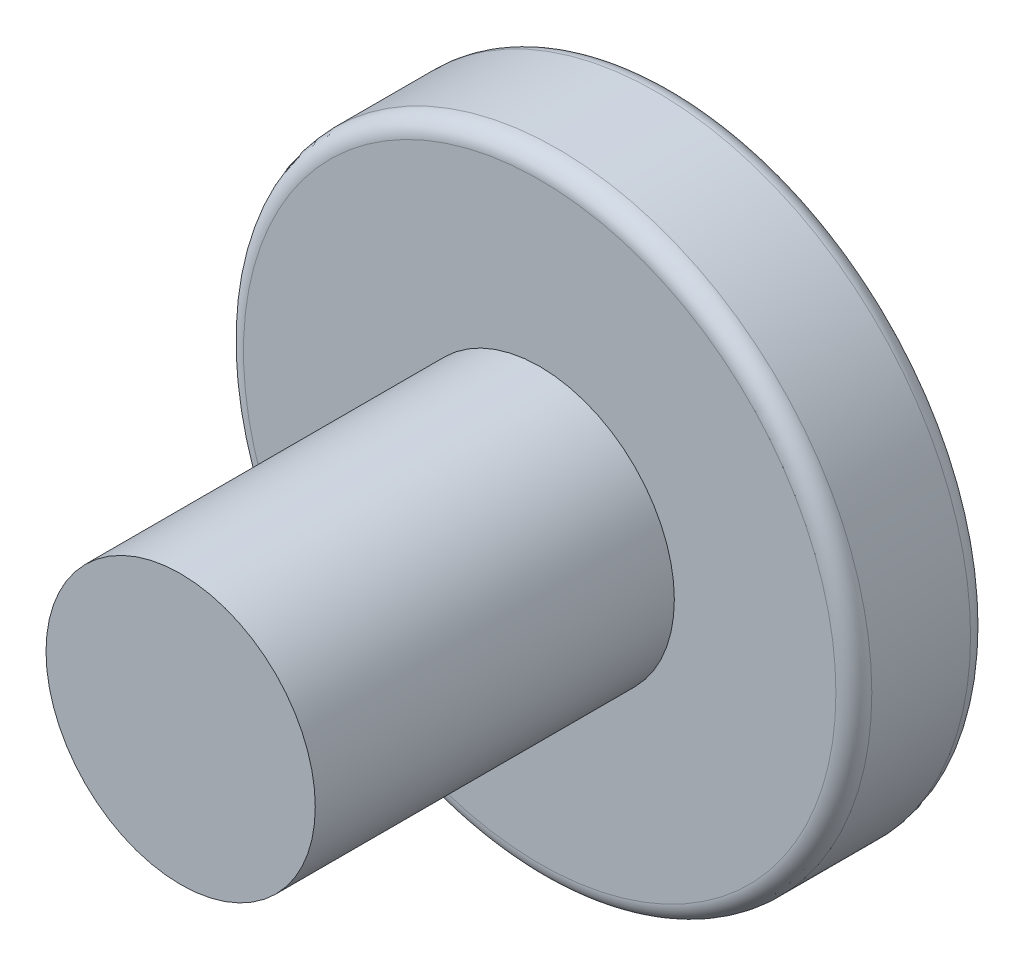
ISO-10303-21;
HEADER;
FILE_DESCRIPTION(('STEP AP214'),'2;1');
FILE_NAME('part.step','',(''),(''),'','','');
FILE_SCHEMA(('AUTOMOTIVE_DESIGN { 1 0 10303 214 1 1 1 1 }'));
ENDSEC;
DATA;
#1=APPLICATION_CONTEXT('core data for automotive mechanical design processes');
#2=APPLICATION_PROTOCOL_DEFINITION('international standard','automotive_design',2000,#1);
#3=PRODUCT_CONTEXT('',#1,'mechanical');
#4=PRODUCT('Part','Part','',(#3));
#5=PRODUCT_RELATED_PRODUCT_CATEGORY('part','',(#4));
#6=PRODUCT_DEFINITION_FORMATION('','',#4);
#7=PRODUCT_DEFINITION_CONTEXT('part definition',#1,'design');
#8=PRODUCT_DEFINITION('design','',#6,#7);
#9=PRODUCT_DEFINITION_SHAPE('','',#8);
#10=(LENGTH_UNIT() NAMED_UNIT(*) SI_UNIT(.MILLI.,.METRE.));
#11=(NAMED_UNIT(*) PLANE_ANGLE_UNIT() SI_UNIT($,.RADIAN.));
#12=(NAMED_UNIT(*) SI_UNIT($,.STERADIAN.) SOLID_ANGLE_UNIT());
#13=UNCERTAINTY_MEASURE_WITH_UNIT(LENGTH_MEASURE(1.E-05),#10,'distance_accuracy_value','');
#14=(GEOMETRIC_REPRESENTATION_CONTEXT(3) GLOBAL_UNCERTAINTY_ASSIGNED_CONTEXT((#13)) GLOBAL_UNIT_ASSIGNED_CONTEXT((#10,
#11,#12)) REPRESENTATION_CONTEXT('',''));
#15=CARTESIAN_POINT('',(0.,0.,0.));
#16=DIRECTION('',(0.,0.,1.));
#17=DIRECTION('',(1.,0.,0.));
#18=AXIS2_PLACEMENT_3D('',#15,#16,#17);
#19=CARTESIAN_POINT('',(0.,0.,1.5));
#20=DIRECTION('',(0.,0.,-1.));
#21=DIRECTION('',(-1.,0.,0.));
#22=AXIS2_PLACEMENT_3D('',#19,#20,#21);
#23=CYLINDRICAL_SURFACE('',#22,3.5);
#24=CARTESIAN_POINT('',(0.,0.,0.2));
#25=DIRECTION('',(0.,0.,1.));
#26=DIRECTION('',(1.,0.,0.));
#27=AXIS2_PLACEMENT_3D('',#24,#25,#26);
#28=CIRCLE('',#27,3.5);
#29=CARTESIAN_POINT('',(3.5,0.,0.2));
#30=VERTEX_POINT('',#29);
#31=EDGE_CURVE('E157',#30,#30,#28,.T.);
#32=ORIENTED_EDGE('',*,*,#31,.T.);
#33=EDGE_LOOP('',(#32));
#34=FACE_BOUND('',#33,.T.);
#35=CARTESIAN_POINT('',(0.,0.,1.3));
#36=DIRECTION('',(0.,0.,1.));
#37=DIRECTION('',(1.,0.,0.));
#38=AXIS2_PLACEMENT_3D('',#35,#36,#37);
#39=CIRCLE('',#38,3.5);
#40=CARTESIAN_POINT('',(3.5,0.,1.3));
#41=VERTEX_POINT('',#40);
#42=EDGE_CURVE('E154',#41,#41,#39,.F.);
#43=ORIENTED_EDGE('',*,*,#42,.T.);
#44=EDGE_LOOP('',(#43));
#45=FACE_BOUND('',#44,.T.);
#46=ADVANCED_FACE('F41',(#34,#45),#23,.T.);
#47=CARTESIAN_POINT('',(0.,0.,1.5));
#48=DIRECTION('',(0.,0.,1.));
#49=DIRECTION('',(1.,0.,0.));
#50=AXIS2_PLACEMENT_3D('',#47,#48,#49);
#51=PLANE('',#50);
#52=CARTESIAN_POINT('',(0.,0.,1.5));
#53=DIRECTION('',(0.,0.,1.));
#54=DIRECTION('',(1.,0.,0.));
#55=AXIS2_PLACEMENT_3D('',#52,#53,#54);
#56=CIRCLE('',#55,3.3);
#57=CARTESIAN_POINT('',(3.3,0.,1.5));
#58=VERTEX_POINT('',#57);
#59=EDGE_CURVE('E11',#58,#58,#56,.T.);
#60=ORIENTED_EDGE('',*,*,#59,.T.);
#61=EDGE_LOOP('',(#60));
#62=FACE_BOUND('',#61,.T.);
#63=CARTESIAN_POINT('',(0.,0.,1.5));
#64=DIRECTION('',(0.,0.,1.));
#65=DIRECTION('',(1.,0.,0.));
#66=AXIS2_PLACEMENT_3D('',#63,#64,#65);
#67=CIRCLE('',#66,1.5);
#68=CARTESIAN_POINT('',(1.5,0.,1.5));
#69=VERTEX_POINT('',#68);
#70=EDGE_CURVE('E151',#69,#69,#67,.T.);
#71=ORIENTED_EDGE('',*,*,#70,.F.);
#72=EDGE_LOOP('',(#71));
#73=FACE_BOUND('',#72,.T.);
#74=ADVANCED_FACE('F172',(#62,#73),#51,.T.);
#75=CARTESIAN_POINT('',(0.,0.,0.));
#76=DIRECTION('',(0.,0.,1.));
#77=DIRECTION('',(1.,0.,0.));
#78=AXIS2_PLACEMENT_3D('',#75,#76,#77);
#79=PLANE('',#78);
#80=DIRECTION('',(0.5,0.866025403784438,0.));
#81=VECTOR('',#80,1.);
#82=CARTESIAN_POINT('',(-1.15470053837925,0.,0.));
#83=LINE('',#82,#81);
#84=CARTESIAN_POINT('',(-1.15470053837925,0.,0.));
#85=VERTEX_POINT('',#84);
#86=CARTESIAN_POINT('',(-0.577350269189626,1.,0.));
#87=VERTEX_POINT('',#86);
#88=EDGE_CURVE('E130',#85,#87,#83,.T.);
#89=ORIENTED_EDGE('',*,*,#88,.F.);
#90=DIRECTION('',(-0.5,0.866025403784439,0.));
#91=VECTOR('',#90,1.);
#92=CARTESIAN_POINT('',(-0.577350269189626,-1.,0.));
#93=LINE('',#92,#91);
#94=CARTESIAN_POINT('',(-0.577350269189626,-1.,0.));
#95=VERTEX_POINT('',#94);
#96=EDGE_CURVE('E56',#95,#85,#93,.T.);
#97=ORIENTED_EDGE('',*,*,#96,.F.);
#98=DIRECTION('',(-1.,0.,0.));
#99=VECTOR('',#98,1.);
#100=CARTESIAN_POINT('',(0.577350269189626,-1.,0.));
#101=LINE('',#100,#99);
#102=CARTESIAN_POINT('',(0.577350269189626,-1.,0.));
#103=VERTEX_POINT('',#102);
#104=EDGE_CURVE('E139',#103,#95,#101,.T.);
#105=ORIENTED_EDGE('',*,*,#104,.F.);
#106=DIRECTION('',(-0.5,-0.866025403784438,0.));
#107=VECTOR('',#106,1.);
#108=CARTESIAN_POINT('',(1.15470053837925,0.,0.));
#109=LINE('',#108,#107);
#110=CARTESIAN_POINT('',(1.15470053837925,0.,0.));
#111=VERTEX_POINT('',#110);
#112=EDGE_CURVE('E137',#111,#103,#109,.T.);
#113=ORIENTED_EDGE('',*,*,#112,.F.);
#114=DIRECTION('',(0.5,-0.866025403784439,0.));
#115=VECTOR('',#114,1.);
#116=CARTESIAN_POINT('',(0.577350269189626,1.,0.));
#117=LINE('',#116,#115);
#118=CARTESIAN_POINT('',(0.577350269189626,1.,0.));
#119=VERTEX_POINT('',#118);
#120=EDGE_CURVE('E104',#119,#111,#117,.T.);
#121=ORIENTED_EDGE('',*,*,#120,.F.);
#122=DIRECTION('',(1.,0.,0.));
#123=VECTOR('',#122,1.);
#124=CARTESIAN_POINT('',(-0.577350269189626,1.,0.));
#125=LINE('',#124,#123);
#126=EDGE_CURVE('E133',#87,#119,#125,.T.);
#127=ORIENTED_EDGE('',*,*,#126,.F.);
#128=EDGE_LOOP('',(#89,#97,#105,#113,#121,#127));
#129=FACE_BOUND('',#128,.T.);
#130=CARTESIAN_POINT('',(0.,0.,0.));
#131=DIRECTION('',(0.,0.,1.));
#132=DIRECTION('',(1.,0.,0.));
#133=AXIS2_PLACEMENT_3D('',#130,#131,#132);
#134=CIRCLE('',#133,3.3);
#135=CARTESIAN_POINT('',(3.3,0.,0.));
#136=VERTEX_POINT('',#135);
#137=EDGE_CURVE('E49',#136,#136,#134,.F.);
#138=ORIENTED_EDGE('',*,*,#137,.T.);
#139=EDGE_LOOP('',(#138));
#140=FACE_BOUND('',#139,.T.);
#141=ADVANCED_FACE('F162',(#129,#140),#79,.F.);
#142=CARTESIAN_POINT('',(0.,0.,5.5));
#143=DIRECTION('',(0.,0.,-1.));
#144=DIRECTION('',(-1.,0.,0.));
#145=AXIS2_PLACEMENT_3D('',#142,#143,#144);
#146=CYLINDRICAL_SURFACE('',#145,1.5);
#147=CARTESIAN_POINT('',(0.,0.,5.5));
#148=DIRECTION('',(0.,0.,1.));
#149=DIRECTION('',(1.,0.,0.));
#150=AXIS2_PLACEMENT_3D('',#147,#148,#149);
#151=CIRCLE('',#150,1.5);
#152=CARTESIAN_POINT('',(1.5,0.,5.5));
#153=VERTEX_POINT('',#152);
#154=EDGE_CURVE('E143',#153,#153,#151,.T.);
#155=ORIENTED_EDGE('',*,*,#154,.F.);
#156=EDGE_LOOP('',(#155));
#157=FACE_BOUND('',#156,.T.);
#158=ORIENTED_EDGE('',*,*,#70,.T.);
#159=EDGE_LOOP('',(#158));
#160=FACE_BOUND('',#159,.T.);
#161=ADVANCED_FACE('F186',(#157,#160),#146,.T.);
#162=CARTESIAN_POINT('',(0.,0.,5.5));
#163=DIRECTION('',(0.,0.,1.));
#164=DIRECTION('',(1.,0.,0.));
#165=AXIS2_PLACEMENT_3D('',#162,#163,#164);
#166=PLANE('',#165);
#167=ORIENTED_EDGE('',*,*,#154,.T.);
#168=EDGE_LOOP('',(#167));
#169=FACE_BOUND('',#168,.T.);
#170=ADVANCED_FACE('F167',(#169),#166,.T.);
#171=CARTESIAN_POINT('',(0.,0.,0.2));
#172=DIRECTION('',(0.,0.,1.));
#173=DIRECTION('',(1.,0.,0.));
#174=AXIS2_PLACEMENT_3D('',#171,#172,#173);
#175=TOROIDAL_SURFACE('',#174,3.3,0.2);
#176=ORIENTED_EDGE('',*,*,#137,.F.);
#177=EDGE_LOOP('',(#176));
#178=FACE_BOUND('',#177,.T.);
#179=ORIENTED_EDGE('',*,*,#31,.F.);
#180=EDGE_LOOP('',(#179));
#181=FACE_BOUND('',#180,.T.);
#182=ADVANCED_FACE('F164',(#178,#181),#175,.T.);
#183=CARTESIAN_POINT('',(0.,0.,1.3));
#184=DIRECTION('',(0.,0.,1.));
#185=DIRECTION('',(1.,0.,0.));
#186=AXIS2_PLACEMENT_3D('',#183,#184,#185);
#187=TOROIDAL_SURFACE('',#186,3.3,0.2);
#188=ORIENTED_EDGE('',*,*,#42,.F.);
#189=EDGE_LOOP('',(#188));
#190=FACE_BOUND('',#189,.T.);
#191=ORIENTED_EDGE('',*,*,#59,.F.);
#192=EDGE_LOOP('',(#191));
#193=FACE_BOUND('',#192,.T.);
#194=ADVANCED_FACE('F43',(#190,#193),#187,.T.);
#195=CARTESIAN_POINT('',(-0.577350269189626,-1.,1.5));
#196=DIRECTION('',(-0.866025403784439,-0.5,0.));
#197=DIRECTION('',(0.5,-0.866025403784439,0.));
#198=AXIS2_PLACEMENT_3D('',#195,#196,#197);
#199=PLANE('',#198);
#200=ORIENTED_EDGE('',*,*,#96,.T.);
#201=DIRECTION('',(0.,0.,-1.));
#202=VECTOR('',#201,1.);
#203=CARTESIAN_POINT('',(-1.15470053837925,0.,1.5));
#204=LINE('',#203,#202);
#205=CARTESIAN_POINT('',(-1.15470053837925,0.,1.5));
#206=VERTEX_POINT('',#205);
#207=EDGE_CURVE('E86',#206,#85,#204,.T.);
#208=ORIENTED_EDGE('',*,*,#207,.F.);
#209=DIRECTION('',(-0.5,0.866025403784439,0.));
#210=VECTOR('',#209,1.);
#211=CARTESIAN_POINT('',(-0.577350269189626,-1.,1.5));
#212=LINE('',#211,#210);
#213=CARTESIAN_POINT('',(-0.577350269189626,-1.,1.5));
#214=VERTEX_POINT('',#213);
#215=EDGE_CURVE('E141',#214,#206,#212,.T.);
#216=ORIENTED_EDGE('',*,*,#215,.F.);
#217=DIRECTION('',(0.,0.,-1.));
#218=VECTOR('',#217,1.);
#219=CARTESIAN_POINT('',(-0.577350269189626,-1.,1.5));
#220=LINE('',#219,#218);
#221=EDGE_CURVE('E64',#214,#95,#220,.T.);
#222=ORIENTED_EDGE('',*,*,#221,.T.);
#223=EDGE_LOOP('',(#200,#208,#216,#222));
#224=FACE_BOUND('',#223,.T.);
#225=ADVANCED_FACE('F178',(#224),#199,.F.);
#226=CARTESIAN_POINT('',(0.577350269189626,-1.,1.5));
#227=DIRECTION('',(0.,-1.,0.));
#228=DIRECTION('',(0.,0.,-1.));
#229=AXIS2_PLACEMENT_3D('',#226,#227,#228);
#230=PLANE('',#229);
#231=ORIENTED_EDGE('',*,*,#104,.T.);
#232=ORIENTED_EDGE('',*,*,#221,.F.);
#233=DIRECTION('',(-1.,0.,0.));
#234=VECTOR('',#233,1.);
#235=CARTESIAN_POINT('',(0.577350269189626,-1.,1.5));
#236=LINE('',#235,#234);
#237=CARTESIAN_POINT('',(0.577350269189626,-1.,1.5));
#238=VERTEX_POINT('',#237);
#239=EDGE_CURVE('E116',#238,#214,#236,.T.);
#240=ORIENTED_EDGE('',*,*,#239,.F.);
#241=DIRECTION('',(0.,0.,-1.));
#242=VECTOR('',#241,1.);
#243=CARTESIAN_POINT('',(0.577350269189626,-1.,1.5));
#244=LINE('',#243,#242);
#245=EDGE_CURVE('E108',#238,#103,#244,.T.);
#246=ORIENTED_EDGE('',*,*,#245,.T.);
#247=EDGE_LOOP('',(#231,#232,#240,#246));
#248=FACE_BOUND('',#247,.T.);
#249=ADVANCED_FACE('F202',(#248),#230,.F.);
#250=CARTESIAN_POINT('',(1.15470053837925,0.,1.5));
#251=DIRECTION('',(0.866025403784439,-0.5,0.));
#252=DIRECTION('',(0.5,0.866025403784439,0.));
#253=AXIS2_PLACEMENT_3D('',#250,#251,#252);
#254=PLANE('',#253);
#255=ORIENTED_EDGE('',*,*,#112,.T.);
#256=ORIENTED_EDGE('',*,*,#245,.F.);
#257=DIRECTION('',(-0.5,-0.866025403784438,0.));
#258=VECTOR('',#257,1.);
#259=CARTESIAN_POINT('',(1.15470053837925,0.,1.5));
#260=LINE('',#259,#258);
#261=CARTESIAN_POINT('',(1.15470053837925,0.,1.5));
#262=VERTEX_POINT('',#261);
#263=EDGE_CURVE('E112',#262,#238,#260,.T.);
#264=ORIENTED_EDGE('',*,*,#263,.F.);
#265=DIRECTION('',(0.,0.,-1.));
#266=VECTOR('',#265,1.);
#267=CARTESIAN_POINT('',(1.15470053837925,0.,1.5));
#268=LINE('',#267,#266);
#269=EDGE_CURVE('E97',#262,#111,#268,.T.);
#270=ORIENTED_EDGE('',*,*,#269,.T.);
#271=EDGE_LOOP('',(#255,#256,#264,#270));
#272=FACE_BOUND('',#271,.T.);
#273=ADVANCED_FACE('F113',(#272),#254,.F.);
#274=CARTESIAN_POINT('',(0.577350269189626,1.,1.5));
#275=DIRECTION('',(0.866025403784439,0.5,0.));
#276=DIRECTION('',(-0.5,0.866025403784439,0.));
#277=AXIS2_PLACEMENT_3D('',#274,#275,#276);
#278=PLANE('',#277);
#279=ORIENTED_EDGE('',*,*,#120,.T.);
#280=ORIENTED_EDGE('',*,*,#269,.F.);
#281=DIRECTION('',(0.5,-0.866025403784439,0.));
#282=VECTOR('',#281,1.);
#283=CARTESIAN_POINT('',(0.577350269189626,1.,1.5));
#284=LINE('',#283,#282);
#285=CARTESIAN_POINT('',(0.577350269189626,1.,1.5));
#286=VERTEX_POINT('',#285);
#287=EDGE_CURVE('E101',#286,#262,#284,.T.);
#288=ORIENTED_EDGE('',*,*,#287,.F.);
#289=DIRECTION('',(0.,0.,-1.));
#290=VECTOR('',#289,1.);
#291=CARTESIAN_POINT('',(0.577350269189626,1.,1.5));
#292=LINE('',#291,#290);
#293=EDGE_CURVE('E109',#286,#119,#292,.T.);
#294=ORIENTED_EDGE('',*,*,#293,.T.);
#295=EDGE_LOOP('',(#279,#280,#288,#294));
#296=FACE_BOUND('',#295,.T.);
#297=ADVANCED_FACE('F99',(#296),#278,.F.);
#298=CARTESIAN_POINT('',(-0.577350269189626,1.,1.5));
#299=DIRECTION('',(0.,1.,0.));
#300=DIRECTION('',(0.,0.,1.));
#301=AXIS2_PLACEMENT_3D('',#298,#299,#300);
#302=PLANE('',#301);
#303=ORIENTED_EDGE('',*,*,#126,.T.);
#304=ORIENTED_EDGE('',*,*,#293,.F.);
#305=DIRECTION('',(1.,0.,0.));
#306=VECTOR('',#305,1.);
#307=CARTESIAN_POINT('',(-0.577350269189626,1.,1.5));
#308=LINE('',#307,#306);
#309=CARTESIAN_POINT('',(-0.577350269189626,1.,1.5));
#310=VERTEX_POINT('',#309);
#311=EDGE_CURVE('E122',#310,#286,#308,.T.);
#312=ORIENTED_EDGE('',*,*,#311,.F.);
#313=DIRECTION('',(0.,0.,-1.));
#314=VECTOR('',#313,1.);
#315=CARTESIAN_POINT('',(-0.577350269189626,1.,1.5));
#316=LINE('',#315,#314);
#317=EDGE_CURVE('E146',#310,#87,#316,.T.);
#318=ORIENTED_EDGE('',*,*,#317,.T.);
#319=EDGE_LOOP('',(#303,#304,#312,#318));
#320=FACE_BOUND('',#319,.T.);
#321=ADVANCED_FACE('F206',(#320),#302,.F.);
#322=CARTESIAN_POINT('',(-1.15470053837925,0.,1.5));
#323=DIRECTION('',(-0.866025403784439,0.5,0.));
#324=DIRECTION('',(-0.5,-0.866025403784439,0.));
#325=AXIS2_PLACEMENT_3D('',#322,#323,#324);
#326=PLANE('',#325);
#327=ORIENTED_EDGE('',*,*,#88,.T.);
#328=ORIENTED_EDGE('',*,*,#317,.F.);
#329=DIRECTION('',(0.5,0.866025403784438,0.));
#330=VECTOR('',#329,1.);
#331=CARTESIAN_POINT('',(-1.15470053837925,0.,1.5));
#332=LINE('',#331,#330);
#333=EDGE_CURVE('E124',#206,#310,#332,.T.);
#334=ORIENTED_EDGE('',*,*,#333,.F.);
#335=ORIENTED_EDGE('',*,*,#207,.T.);
#336=EDGE_LOOP('',(#327,#328,#334,#335));
#337=FACE_BOUND('',#336,.T.);
#338=ADVANCED_FACE('F203',(#337),#326,.F.);
#339=CARTESIAN_POINT('',(0.,0.,1.5));
#340=DIRECTION('',(0.,0.,-1.));
#341=DIRECTION('',(-1.,0.,0.));
#342=AXIS2_PLACEMENT_3D('',#339,#340,#341);
#343=PLANE('',#342);
#344=ORIENTED_EDGE('',*,*,#215,.T.);
#345=ORIENTED_EDGE('',*,*,#333,.T.);
#346=ORIENTED_EDGE('',*,*,#311,.T.);
#347=ORIENTED_EDGE('',*,*,#287,.T.);
#348=ORIENTED_EDGE('',*,*,#263,.T.);
#349=ORIENTED_EDGE('',*,*,#239,.T.);
#350=EDGE_LOOP('',(#344,#345,#346,#347,#348,#349));
#351=FACE_BOUND('',#350,.T.);
#352=ADVANCED_FACE('F119',(#351),#343,.T.);
#353=CLOSED_SHELL('',(#46,#74,#141,#161,#170,#182,#194,#225,#249,#273,#297,#321,#338,#352));
#354=MANIFOLD_SOLID_BREP('B2',#353);
#355=ADVANCED_BREP_SHAPE_REPRESENTATION('',(#18,#354),#14);
#356=SHAPE_DEFINITION_REPRESENTATION(#9,#355);
ENDSEC;
END-ISO-10303-21;
